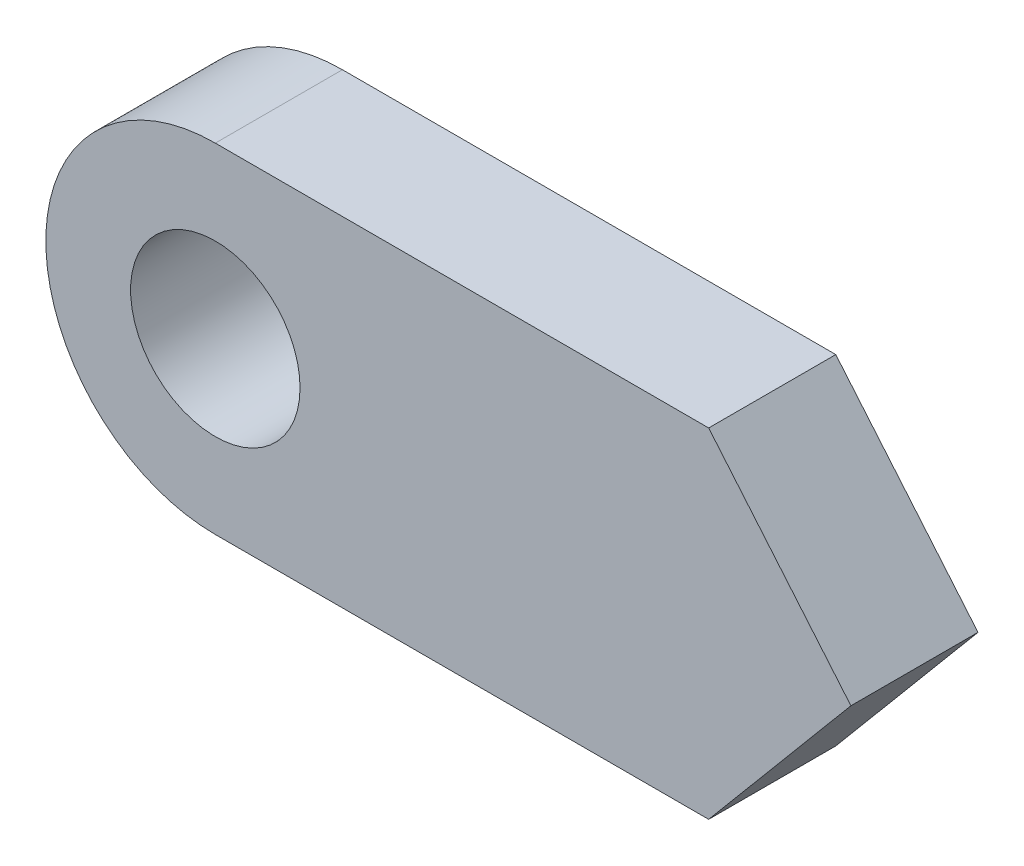
ISO-10303-21;
HEADER;
FILE_DESCRIPTION(('STEP AP214'),'2;1');
FILE_NAME('part.step','',(''),(''),'','','');
FILE_SCHEMA(('AUTOMOTIVE_DESIGN { 1 0 10303 214 1 1 1 1 }'));
ENDSEC;
DATA;
#1=APPLICATION_CONTEXT('core data for automotive mechanical design processes');
#2=APPLICATION_PROTOCOL_DEFINITION('international standard','automotive_design',2000,#1);
#3=PRODUCT_CONTEXT('',#1,'mechanical');
#4=PRODUCT('Part','Part','',(#3));
#5=PRODUCT_RELATED_PRODUCT_CATEGORY('part','',(#4));
#6=PRODUCT_DEFINITION_FORMATION('','',#4);
#7=PRODUCT_DEFINITION_CONTEXT('part definition',#1,'design');
#8=PRODUCT_DEFINITION('design','',#6,#7);
#9=PRODUCT_DEFINITION_SHAPE('','',#8);
#10=(LENGTH_UNIT() NAMED_UNIT(*) SI_UNIT(.MILLI.,.METRE.));
#11=(NAMED_UNIT(*) PLANE_ANGLE_UNIT() SI_UNIT($,.RADIAN.));
#12=(NAMED_UNIT(*) SI_UNIT($,.STERADIAN.) SOLID_ANGLE_UNIT());
#13=UNCERTAINTY_MEASURE_WITH_UNIT(LENGTH_MEASURE(1.E-05),#10,'distance_accuracy_value','');
#14=(GEOMETRIC_REPRESENTATION_CONTEXT(3) GLOBAL_UNCERTAINTY_ASSIGNED_CONTEXT((#13)) GLOBAL_UNIT_ASSIGNED_CONTEXT((#10,
#11,#12)) REPRESENTATION_CONTEXT('',''));
#15=CARTESIAN_POINT('',(0.,0.,0.));
#16=DIRECTION('',(0.,0.,1.));
#17=DIRECTION('',(1.,0.,0.));
#18=AXIS2_PLACEMENT_3D('',#15,#16,#17);
#19=CARTESIAN_POINT('',(0.,0.,30.));
#20=DIRECTION('',(0.,1.,0.));
#21=DIRECTION('',(-1.,0.,0.));
#22=AXIS2_PLACEMENT_3D('',#19,#20,#21);
#23=PLANE('',#22);
#24=DIRECTION('',(1.,0.,0.));
#25=VECTOR('',#24,1.);
#26=CARTESIAN_POINT('',(0.,0.,0.));
#27=LINE('',#26,#25);
#28=CARTESIAN_POINT('',(0.,0.,0.));
#29=VERTEX_POINT('',#28);
#30=CARTESIAN_POINT('',(116.439999924811,0.,0.));
#31=VERTEX_POINT('',#30);
#32=EDGE_CURVE('E123',#29,#31,#27,.T.);
#33=ORIENTED_EDGE('',*,*,#32,.F.);
#34=DIRECTION('',(0.,0.,-1.));
#35=VECTOR('',#34,1.);
#36=CARTESIAN_POINT('',(0.,0.,30.));
#37=LINE('',#36,#35);
#38=CARTESIAN_POINT('',(0.,0.,30.));
#39=VERTEX_POINT('',#38);
#40=EDGE_CURVE('E13',#39,#29,#37,.T.);
#41=ORIENTED_EDGE('',*,*,#40,.F.);
#42=DIRECTION('',(1.,0.,0.));
#43=VECTOR('',#42,1.);
#44=CARTESIAN_POINT('',(0.,0.,30.));
#45=LINE('',#44,#43);
#46=CARTESIAN_POINT('',(116.439999924811,0.,30.));
#47=VERTEX_POINT('',#46);
#48=EDGE_CURVE('E164',#39,#47,#45,.T.);
#49=ORIENTED_EDGE('',*,*,#48,.T.);
#50=DIRECTION('',(0.,0.,-1.));
#51=VECTOR('',#50,1.);
#52=CARTESIAN_POINT('',(116.439999924811,0.,30.));
#53=LINE('',#52,#51);
#54=EDGE_CURVE('E88',#47,#31,#53,.T.);
#55=ORIENTED_EDGE('',*,*,#54,.T.);
#56=EDGE_LOOP('',(#33,#41,#49,#55));
#57=FACE_BOUND('',#56,.T.);
#58=ADVANCED_FACE('F46',(#57),#23,.T.);
#59=CARTESIAN_POINT('',(0.,-40.,30.));
#60=DIRECTION('',(0.,0.,-1.));
#61=DIRECTION('',(-1.,0.,0.));
#62=AXIS2_PLACEMENT_3D('',#59,#60,#61);
#63=CYLINDRICAL_SURFACE('',#62,40.);
#64=CARTESIAN_POINT('',(0.,-40.,0.));
#65=DIRECTION('',(0.,0.,1.));
#66=DIRECTION('',(1.,0.,0.));
#67=AXIS2_PLACEMENT_3D('',#64,#65,#66);
#68=CIRCLE('',#67,40.);
#69=CARTESIAN_POINT('',(0.,-80.,0.));
#70=VERTEX_POINT('',#69);
#71=EDGE_CURVE('E126',#29,#70,#68,.T.);
#72=ORIENTED_EDGE('',*,*,#71,.T.);
#73=DIRECTION('',(0.,0.,-1.));
#74=VECTOR('',#73,1.);
#75=CARTESIAN_POINT('',(0.,-80.,30.));
#76=LINE('',#75,#74);
#77=CARTESIAN_POINT('',(0.,-80.,30.));
#78=VERTEX_POINT('',#77);
#79=EDGE_CURVE('E55',#78,#70,#76,.T.);
#80=ORIENTED_EDGE('',*,*,#79,.F.);
#81=CARTESIAN_POINT('',(0.,-40.,30.));
#82=DIRECTION('',(0.,0.,1.));
#83=DIRECTION('',(1.,0.,0.));
#84=AXIS2_PLACEMENT_3D('',#81,#82,#83);
#85=CIRCLE('',#84,40.);
#86=EDGE_CURVE('E102',#39,#78,#85,.T.);
#87=ORIENTED_EDGE('',*,*,#86,.F.);
#88=ORIENTED_EDGE('',*,*,#40,.T.);
#89=EDGE_LOOP('',(#72,#80,#87,#88));
#90=FACE_BOUND('',#89,.T.);
#91=ADVANCED_FACE('F138',(#90),#63,.T.);
#92=CARTESIAN_POINT('',(0.,-80.,30.));
#93=DIRECTION('',(0.,1.,0.));
#94=DIRECTION('',(-1.,0.,0.));
#95=AXIS2_PLACEMENT_3D('',#92,#93,#94);
#96=PLANE('',#95);
#97=DIRECTION('',(1.,0.,0.));
#98=VECTOR('',#97,1.);
#99=CARTESIAN_POINT('',(0.,-80.,0.));
#100=LINE('',#99,#98);
#101=CARTESIAN_POINT('',(116.439999924811,-80.,0.));
#102=VERTEX_POINT('',#101);
#103=EDGE_CURVE('E110',#70,#102,#100,.T.);
#104=ORIENTED_EDGE('',*,*,#103,.T.);
#105=DIRECTION('',(0.,0.,-1.));
#106=VECTOR('',#105,1.);
#107=CARTESIAN_POINT('',(116.439999924811,-80.,30.));
#108=LINE('',#107,#106);
#109=CARTESIAN_POINT('',(116.439999924811,-80.,30.));
#110=VERTEX_POINT('',#109);
#111=EDGE_CURVE('E108',#110,#102,#108,.T.);
#112=ORIENTED_EDGE('',*,*,#111,.F.);
#113=DIRECTION('',(1.,0.,0.));
#114=VECTOR('',#113,1.);
#115=CARTESIAN_POINT('',(0.,-80.,30.));
#116=LINE('',#115,#114);
#117=EDGE_CURVE('E97',#78,#110,#116,.T.);
#118=ORIENTED_EDGE('',*,*,#117,.F.);
#119=ORIENTED_EDGE('',*,*,#79,.T.);
#120=EDGE_LOOP('',(#104,#112,#118,#119));
#121=FACE_BOUND('',#120,.T.);
#122=ADVANCED_FACE('F109',(#121),#96,.F.);
#123=CARTESIAN_POINT('',(107.722106980134,-90.3895802366708,30.));
#124=DIRECTION('',(0.766044443118975,-0.642787609686543,0.));
#125=DIRECTION('',(0.642787609686543,0.766044443118975,0.));
#126=AXIS2_PLACEMENT_3D('',#123,#124,#125);
#127=PLANE('',#126);
#128=DIRECTION('',(-0.642787609686543,-0.766044443118975,0.));
#129=VECTOR('',#128,1.);
#130=CARTESIAN_POINT('',(107.722106980134,-90.3895802366708,0.));
#131=LINE('',#130,#129);
#132=CARTESIAN_POINT('',(150.003985171903,-40.,0.));
#133=VERTEX_POINT('',#132);
#134=EDGE_CURVE('E130',#133,#102,#131,.T.);
#135=ORIENTED_EDGE('',*,*,#134,.F.);
#136=DIRECTION('',(0.,0.,-1.));
#137=VECTOR('',#136,1.);
#138=CARTESIAN_POINT('',(150.003985171903,-40.,30.));
#139=LINE('',#138,#137);
#140=CARTESIAN_POINT('',(150.003985171903,-40.,30.));
#141=VERTEX_POINT('',#140);
#142=EDGE_CURVE('E81',#141,#133,#139,.T.);
#143=ORIENTED_EDGE('',*,*,#142,.F.);
#144=DIRECTION('',(-0.642787609686543,-0.766044443118975,0.));
#145=VECTOR('',#144,1.);
#146=CARTESIAN_POINT('',(107.722106980134,-90.3895802366708,30.));
#147=LINE('',#146,#145);
#148=EDGE_CURVE('E101',#141,#110,#147,.T.);
#149=ORIENTED_EDGE('',*,*,#148,.T.);
#150=ORIENTED_EDGE('',*,*,#111,.T.);
#151=EDGE_LOOP('',(#135,#143,#149,#150));
#152=FACE_BOUND('',#151,.T.);
#153=ADVANCED_FACE('F115',(#152),#127,.T.);
#154=CARTESIAN_POINT('',(0.,-40.,30.));
#155=DIRECTION('',(0.,0.,-1.));
#156=DIRECTION('',(-1.,0.,0.));
#157=AXIS2_PLACEMENT_3D('',#154,#155,#156);
#158=CYLINDRICAL_SURFACE('',#157,20.);
#159=CARTESIAN_POINT('',(0.,-40.,30.));
#160=DIRECTION('',(0.,0.,1.));
#161=DIRECTION('',(1.,0.,0.));
#162=AXIS2_PLACEMENT_3D('',#159,#160,#161);
#163=CIRCLE('',#162,20.);
#164=CARTESIAN_POINT('',(20.,-40.,30.));
#165=VERTEX_POINT('',#164);
#166=EDGE_CURVE('E134',#165,#165,#163,.T.);
#167=ORIENTED_EDGE('',*,*,#166,.T.);
#168=EDGE_LOOP('',(#167));
#169=FACE_BOUND('',#168,.T.);
#170=CARTESIAN_POINT('',(0.,-40.,0.));
#171=DIRECTION('',(0.,0.,1.));
#172=DIRECTION('',(1.,0.,0.));
#173=AXIS2_PLACEMENT_3D('',#170,#171,#172);
#174=CIRCLE('',#173,20.);
#175=CARTESIAN_POINT('',(20.,-40.,0.));
#176=VERTEX_POINT('',#175);
#177=EDGE_CURVE('E120',#176,#176,#174,.T.);
#178=ORIENTED_EDGE('',*,*,#177,.F.);
#179=EDGE_LOOP('',(#178));
#180=FACE_BOUND('',#179,.T.);
#181=ADVANCED_FACE('F48',(#169,#180),#158,.F.);
#182=CARTESIAN_POINT('',(68.3297968596456,57.3355073433476,30.));
#183=DIRECTION('',(-0.766044443118975,-0.642787609686542,0.));
#184=DIRECTION('',(0.642787609686542,-0.766044443118975,0.));
#185=AXIS2_PLACEMENT_3D('',#182,#183,#184);
#186=PLANE('',#185);
#187=DIRECTION('',(-0.642787609686543,0.766044443118976,0.));
#188=VECTOR('',#187,1.);
#189=CARTESIAN_POINT('',(68.3297968596456,57.3355073433476,0.));
#190=LINE('',#189,#188);
#191=EDGE_CURVE('E132',#133,#31,#190,.T.);
#192=ORIENTED_EDGE('',*,*,#191,.T.);
#193=ORIENTED_EDGE('',*,*,#54,.F.);
#194=DIRECTION('',(-0.642787609686543,0.766044443118976,0.));
#195=VECTOR('',#194,1.);
#196=CARTESIAN_POINT('',(68.3297968596456,57.3355073433476,30.));
#197=LINE('',#196,#195);
#198=EDGE_CURVE('E63',#141,#47,#197,.T.);
#199=ORIENTED_EDGE('',*,*,#198,.F.);
#200=ORIENTED_EDGE('',*,*,#142,.T.);
#201=EDGE_LOOP('',(#192,#193,#199,#200));
#202=FACE_BOUND('',#201,.T.);
#203=ADVANCED_FACE('F151',(#202),#186,.F.);
#204=CARTESIAN_POINT('',(0.,0.,30.));
#205=DIRECTION('',(0.,0.,1.));
#206=DIRECTION('',(1.,0.,0.));
#207=AXIS2_PLACEMENT_3D('',#204,#205,#206);
#208=PLANE('',#207);
#209=ORIENTED_EDGE('',*,*,#166,.F.);
#210=EDGE_LOOP('',(#209));
#211=FACE_BOUND('',#210,.T.);
#212=ORIENTED_EDGE('',*,*,#48,.F.);
#213=ORIENTED_EDGE('',*,*,#86,.T.);
#214=ORIENTED_EDGE('',*,*,#117,.T.);
#215=ORIENTED_EDGE('',*,*,#148,.F.);
#216=ORIENTED_EDGE('',*,*,#198,.T.);
#217=EDGE_LOOP('',(#212,#213,#214,#215,#216));
#218=FACE_BOUND('',#217,.T.);
#219=ADVANCED_FACE('F99',(#211,#218),#208,.T.);
#220=CARTESIAN_POINT('',(0.,0.,0.));
#221=DIRECTION('',(0.,0.,1.));
#222=DIRECTION('',(1.,0.,0.));
#223=AXIS2_PLACEMENT_3D('',#220,#221,#222);
#224=PLANE('',#223);
#225=ORIENTED_EDGE('',*,*,#177,.T.);
#226=EDGE_LOOP('',(#225));
#227=FACE_BOUND('',#226,.T.);
#228=ORIENTED_EDGE('',*,*,#32,.T.);
#229=ORIENTED_EDGE('',*,*,#191,.F.);
#230=ORIENTED_EDGE('',*,*,#134,.T.);
#231=ORIENTED_EDGE('',*,*,#103,.F.);
#232=ORIENTED_EDGE('',*,*,#71,.F.);
#233=EDGE_LOOP('',(#228,#229,#230,#231,#232));
#234=FACE_BOUND('',#233,.T.);
#235=ADVANCED_FACE('F140',(#227,#234),#224,.F.);
#236=CLOSED_SHELL('',(#58,#91,#122,#153,#181,#203,#219,#235));
#237=MANIFOLD_SOLID_BREP('B2',#236);
#238=ADVANCED_BREP_SHAPE_REPRESENTATION('',(#18,#237),#14);
#239=SHAPE_DEFINITION_REPRESENTATION(#9,#238);
ENDSEC;
END-ISO-10303-21;
